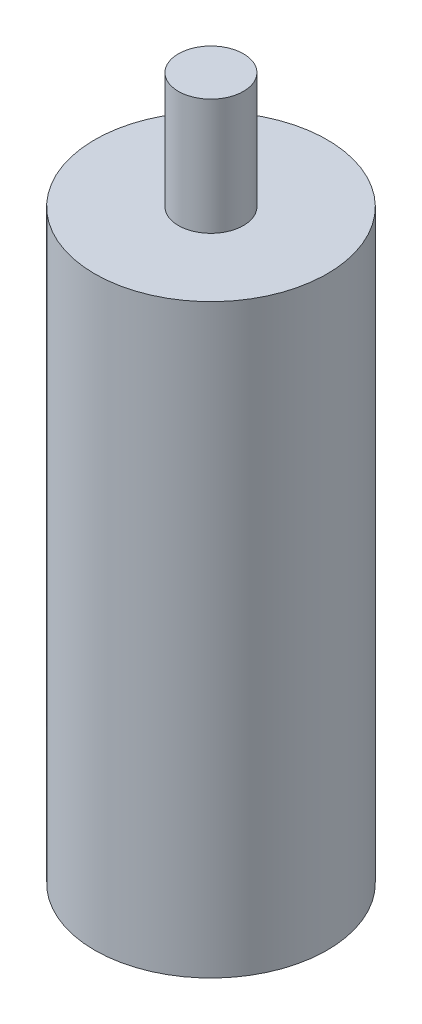
ISO-10303-21;
HEADER;
FILE_DESCRIPTION(('STEP AP214'),'2;1');
FILE_NAME('part.step','',(''),(''),'','','');
FILE_SCHEMA(('AUTOMOTIVE_DESIGN { 1 0 10303 214 1 1 1 1 }'));
ENDSEC;
DATA;
#1=APPLICATION_CONTEXT('core data for automotive mechanical design processes');
#2=APPLICATION_PROTOCOL_DEFINITION('international standard','automotive_design',2000,#1);
#3=PRODUCT_CONTEXT('',#1,'mechanical');
#4=PRODUCT('Part','Part','',(#3));
#5=PRODUCT_RELATED_PRODUCT_CATEGORY('part','',(#4));
#6=PRODUCT_DEFINITION_FORMATION('','',#4);
#7=PRODUCT_DEFINITION_CONTEXT('part definition',#1,'design');
#8=PRODUCT_DEFINITION('design','',#6,#7);
#9=PRODUCT_DEFINITION_SHAPE('','',#8);
#10=(LENGTH_UNIT() NAMED_UNIT(*) SI_UNIT(.MILLI.,.METRE.));
#11=(NAMED_UNIT(*) PLANE_ANGLE_UNIT() SI_UNIT($,.RADIAN.));
#12=(NAMED_UNIT(*) SI_UNIT($,.STERADIAN.) SOLID_ANGLE_UNIT());
#13=UNCERTAINTY_MEASURE_WITH_UNIT(LENGTH_MEASURE(1.E-05),#10,'distance_accuracy_value','');
#14=(GEOMETRIC_REPRESENTATION_CONTEXT(3) GLOBAL_UNCERTAINTY_ASSIGNED_CONTEXT((#13)) GLOBAL_UNIT_ASSIGNED_CONTEXT((#10,
#11,#12)) REPRESENTATION_CONTEXT('',''));
#15=CARTESIAN_POINT('',(0.,0.,0.));
#16=DIRECTION('',(0.,0.,1.));
#17=DIRECTION('',(1.,0.,0.));
#18=AXIS2_PLACEMENT_3D('',#15,#16,#17);
#19=CARTESIAN_POINT('',(0.,63.,0.));
#20=DIRECTION('',(0.,-1.,0.));
#21=DIRECTION('',(0.,0.,-1.));
#22=AXIS2_PLACEMENT_3D('',#19,#20,#21);
#23=CYLINDRICAL_SURFACE('',#22,12.5);
#24=CARTESIAN_POINT('',(0.,63.,0.));
#25=DIRECTION('',(0.,1.,0.));
#26=DIRECTION('',(0.,0.,1.));
#27=AXIS2_PLACEMENT_3D('',#24,#25,#26);
#28=CIRCLE('',#27,12.5);
#29=CARTESIAN_POINT('',(0.,63.,12.5));
#30=VERTEX_POINT('',#29);
#31=EDGE_CURVE('E44',#30,#30,#28,.T.);
#32=ORIENTED_EDGE('',*,*,#31,.F.);
#33=EDGE_LOOP('',(#32));
#34=FACE_BOUND('',#33,.T.);
#35=CARTESIAN_POINT('',(0.,0.,0.));
#36=DIRECTION('',(0.,1.,0.));
#37=DIRECTION('',(0.,0.,1.));
#38=AXIS2_PLACEMENT_3D('',#35,#36,#37);
#39=CIRCLE('',#38,12.5);
#40=CARTESIAN_POINT('',(0.,0.,12.5));
#41=VERTEX_POINT('',#40);
#42=EDGE_CURVE('E40',#41,#41,#39,.T.);
#43=ORIENTED_EDGE('',*,*,#42,.T.);
#44=EDGE_LOOP('',(#43));
#45=FACE_BOUND('',#44,.T.);
#46=ADVANCED_FACE('F37',(#34,#45),#23,.T.);
#47=CARTESIAN_POINT('',(0.,63.,0.));
#48=DIRECTION('',(0.,1.,0.));
#49=DIRECTION('',(0.,0.,1.));
#50=AXIS2_PLACEMENT_3D('',#47,#48,#49);
#51=PLANE('',#50);
#52=CARTESIAN_POINT('',(0.,63.,0.));
#53=DIRECTION('',(0.,1.,0.));
#54=DIRECTION('',(0.,0.,1.));
#55=AXIS2_PLACEMENT_3D('',#52,#53,#54);
#56=CIRCLE('',#55,3.5);
#57=CARTESIAN_POINT('',(0.,63.,3.5));
#58=VERTEX_POINT('',#57);
#59=EDGE_CURVE('E10',#58,#58,#56,.T.);
#60=ORIENTED_EDGE('',*,*,#59,.F.);
#61=EDGE_LOOP('',(#60));
#62=FACE_BOUND('',#61,.T.);
#63=ORIENTED_EDGE('',*,*,#31,.T.);
#64=EDGE_LOOP('',(#63));
#65=FACE_BOUND('',#64,.T.);
#66=ADVANCED_FACE('F61',(#62,#65),#51,.T.);
#67=CARTESIAN_POINT('',(0.,0.,0.));
#68=DIRECTION('',(0.,1.,0.));
#69=DIRECTION('',(0.,0.,1.));
#70=AXIS2_PLACEMENT_3D('',#67,#68,#69);
#71=PLANE('',#70);
#72=ORIENTED_EDGE('',*,*,#42,.F.);
#73=EDGE_LOOP('',(#72));
#74=FACE_BOUND('',#73,.T.);
#75=ADVANCED_FACE('F58',(#74),#71,.F.);
#76=CARTESIAN_POINT('',(0.,75.5,0.));
#77=DIRECTION('',(0.,-1.,0.));
#78=DIRECTION('',(0.,0.,-1.));
#79=AXIS2_PLACEMENT_3D('',#76,#77,#78);
#80=CYLINDRICAL_SURFACE('',#79,3.5);
#81=CARTESIAN_POINT('',(0.,75.5,0.));
#82=DIRECTION('',(0.,1.,0.));
#83=DIRECTION('',(0.,0.,1.));
#84=AXIS2_PLACEMENT_3D('',#81,#82,#83);
#85=CIRCLE('',#84,3.5);
#86=CARTESIAN_POINT('',(0.,75.5,3.5));
#87=VERTEX_POINT('',#86);
#88=EDGE_CURVE('E50',#87,#87,#85,.T.);
#89=ORIENTED_EDGE('',*,*,#88,.F.);
#90=EDGE_LOOP('',(#89));
#91=FACE_BOUND('',#90,.T.);
#92=ORIENTED_EDGE('',*,*,#59,.T.);
#93=EDGE_LOOP('',(#92));
#94=FACE_BOUND('',#93,.T.);
#95=ADVANCED_FACE('F60',(#91,#94),#80,.T.);
#96=CARTESIAN_POINT('',(0.,75.5,0.));
#97=DIRECTION('',(0.,1.,0.));
#98=DIRECTION('',(0.,0.,1.));
#99=AXIS2_PLACEMENT_3D('',#96,#97,#98);
#100=PLANE('',#99);
#101=ORIENTED_EDGE('',*,*,#88,.T.);
#102=EDGE_LOOP('',(#101));
#103=FACE_BOUND('',#102,.T.);
#104=ADVANCED_FACE('F67',(#103),#100,.T.);
#105=CLOSED_SHELL('',(#46,#66,#75,#95,#104));
#106=MANIFOLD_SOLID_BREP('B2',#105);
#107=ADVANCED_BREP_SHAPE_REPRESENTATION('',(#18,#106),#14);
#108=SHAPE_DEFINITION_REPRESENTATION(#9,#107);
ENDSEC;
END-ISO-10303-21;
